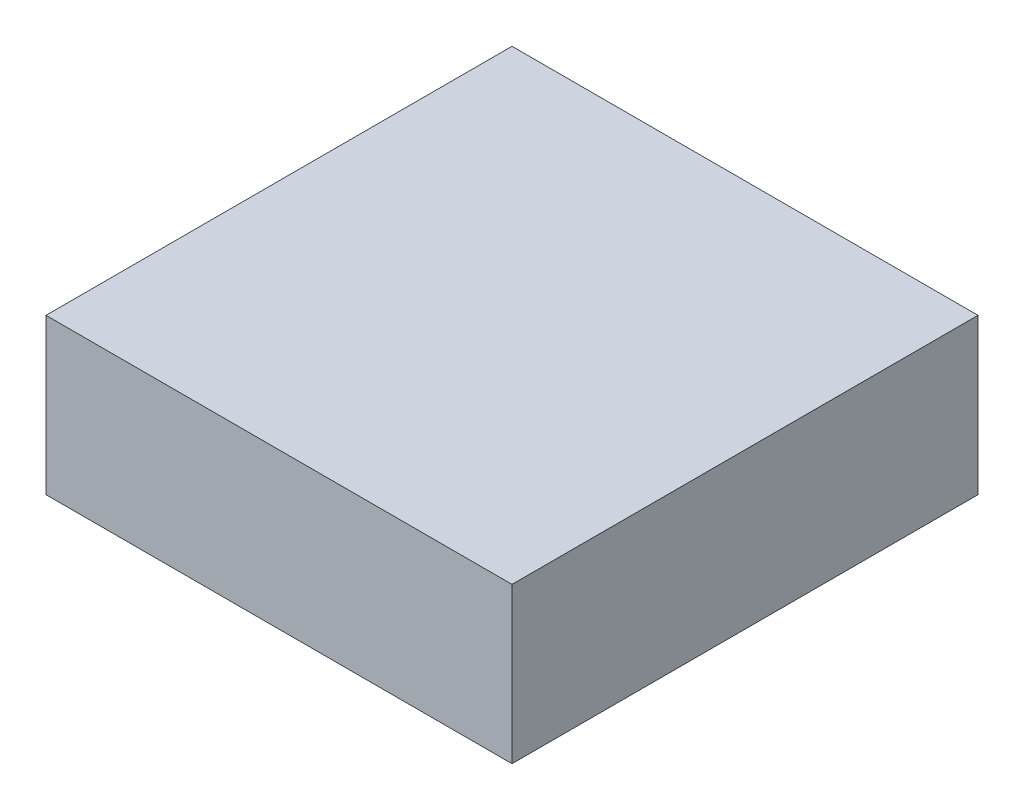
ISO-10303-21;
HEADER;
FILE_DESCRIPTION(('STEP AP214'),'2;1');
FILE_NAME('part.step','',(''),(''),'','','');
FILE_SCHEMA(('AUTOMOTIVE_DESIGN { 1 0 10303 214 1 1 1 1 }'));
ENDSEC;
DATA;
#1=APPLICATION_CONTEXT('core data for automotive mechanical design processes');
#2=APPLICATION_PROTOCOL_DEFINITION('international standard','automotive_design',2000,#1);
#3=PRODUCT_CONTEXT('',#1,'mechanical');
#4=PRODUCT('Part','Part','',(#3));
#5=PRODUCT_RELATED_PRODUCT_CATEGORY('part','',(#4));
#6=PRODUCT_DEFINITION_FORMATION('','',#4);
#7=PRODUCT_DEFINITION_CONTEXT('part definition',#1,'design');
#8=PRODUCT_DEFINITION('design','',#6,#7);
#9=PRODUCT_DEFINITION_SHAPE('','',#8);
#10=(LENGTH_UNIT() NAMED_UNIT(*) SI_UNIT(.MILLI.,.METRE.));
#11=(NAMED_UNIT(*) PLANE_ANGLE_UNIT() SI_UNIT($,.RADIAN.));
#12=(NAMED_UNIT(*) SI_UNIT($,.STERADIAN.) SOLID_ANGLE_UNIT());
#13=UNCERTAINTY_MEASURE_WITH_UNIT(LENGTH_MEASURE(1.E-05),#10,'distance_accuracy_value','');
#14=(GEOMETRIC_REPRESENTATION_CONTEXT(3) GLOBAL_UNCERTAINTY_ASSIGNED_CONTEXT((#13)) GLOBAL_UNIT_ASSIGNED_CONTEXT((#10,
#11,#12)) REPRESENTATION_CONTEXT('',''));
#15=CARTESIAN_POINT('',(0.,0.,0.));
#16=DIRECTION('',(0.,0.,1.));
#17=DIRECTION('',(1.,0.,0.));
#18=AXIS2_PLACEMENT_3D('',#15,#16,#17);
#19=CARTESIAN_POINT('',(6.30000000000001,4.2,6.29999999999999));
#20=DIRECTION('',(-1.,0.,0.));
#21=DIRECTION('',(0.,0.,1.));
#22=AXIS2_PLACEMENT_3D('',#19,#20,#21);
#23=PLANE('',#22);
#24=DIRECTION('',(0.,0.,-1.));
#25=VECTOR('',#24,1.);
#26=CARTESIAN_POINT('',(6.30000000000001,0.,6.29999999999999));
#27=LINE('',#26,#25);
#28=CARTESIAN_POINT('',(6.30000000000001,0.,6.29999999999999));
#29=VERTEX_POINT('',#28);
#30=CARTESIAN_POINT('',(6.30000000000001,0.,-6.30000000000001));
#31=VERTEX_POINT('',#30);
#32=EDGE_CURVE('E96',#29,#31,#27,.T.);
#33=ORIENTED_EDGE('',*,*,#32,.T.);
#34=DIRECTION('',(0.,-1.,0.));
#35=VECTOR('',#34,1.);
#36=CARTESIAN_POINT('',(6.30000000000001,4.2,-6.30000000000001));
#37=LINE('',#36,#35);
#38=CARTESIAN_POINT('',(6.30000000000001,4.2,-6.30000000000001));
#39=VERTEX_POINT('',#38);
#40=EDGE_CURVE('E11',#39,#31,#37,.T.);
#41=ORIENTED_EDGE('',*,*,#40,.F.);
#42=DIRECTION('',(0.,0.,-1.));
#43=VECTOR('',#42,1.);
#44=CARTESIAN_POINT('',(6.30000000000001,4.2,6.29999999999999));
#45=LINE('',#44,#43);
#46=CARTESIAN_POINT('',(6.30000000000001,4.2,6.29999999999999));
#47=VERTEX_POINT('',#46);
#48=EDGE_CURVE('E84',#47,#39,#45,.T.);
#49=ORIENTED_EDGE('',*,*,#48,.F.);
#50=DIRECTION('',(0.,-1.,0.));
#51=VECTOR('',#50,1.);
#52=CARTESIAN_POINT('',(6.30000000000001,4.2,6.29999999999999));
#53=LINE('',#52,#51);
#54=EDGE_CURVE('E92',#47,#29,#53,.T.);
#55=ORIENTED_EDGE('',*,*,#54,.T.);
#56=EDGE_LOOP('',(#33,#41,#49,#55));
#57=FACE_BOUND('',#56,.T.);
#58=ADVANCED_FACE('F33',(#57),#23,.F.);
#59=CARTESIAN_POINT('',(-6.29999999999999,4.2,-6.30000000000001));
#60=DIRECTION('',(0.,0.,1.));
#61=DIRECTION('',(1.,0.,0.));
#62=AXIS2_PLACEMENT_3D('',#59,#60,#61);
#63=PLANE('',#62);
#64=DIRECTION('',(-1.,0.,0.));
#65=VECTOR('',#64,1.);
#66=CARTESIAN_POINT('',(-6.29999999999999,0.,-6.30000000000001));
#67=LINE('',#66,#65);
#68=CARTESIAN_POINT('',(-6.29999999999999,0.,-6.30000000000001));
#69=VERTEX_POINT('',#68);
#70=EDGE_CURVE('E88',#31,#69,#67,.T.);
#71=ORIENTED_EDGE('',*,*,#70,.T.);
#72=DIRECTION('',(0.,-1.,0.));
#73=VECTOR('',#72,1.);
#74=CARTESIAN_POINT('',(-6.29999999999999,4.2,-6.30000000000001));
#75=LINE('',#74,#73);
#76=CARTESIAN_POINT('',(-6.29999999999999,4.2,-6.30000000000001));
#77=VERTEX_POINT('',#76);
#78=EDGE_CURVE('E41',#77,#69,#75,.T.);
#79=ORIENTED_EDGE('',*,*,#78,.F.);
#80=DIRECTION('',(-1.,0.,0.));
#81=VECTOR('',#80,1.);
#82=CARTESIAN_POINT('',(-6.29999999999999,4.2,-6.30000000000001));
#83=LINE('',#82,#81);
#84=EDGE_CURVE('E79',#39,#77,#83,.T.);
#85=ORIENTED_EDGE('',*,*,#84,.F.);
#86=ORIENTED_EDGE('',*,*,#40,.T.);
#87=EDGE_LOOP('',(#71,#79,#85,#86));
#88=FACE_BOUND('',#87,.T.);
#89=ADVANCED_FACE('F87',(#88),#63,.F.);
#90=CARTESIAN_POINT('',(-6.29999999999999,4.2,6.29999999999999));
#91=DIRECTION('',(1.,0.,0.));
#92=DIRECTION('',(0.,0.,-1.));
#93=AXIS2_PLACEMENT_3D('',#90,#91,#92);
#94=PLANE('',#93);
#95=DIRECTION('',(0.,0.,1.));
#96=VECTOR('',#95,1.);
#97=CARTESIAN_POINT('',(-6.29999999999999,0.,6.29999999999999));
#98=LINE('',#97,#96);
#99=CARTESIAN_POINT('',(-6.29999999999999,0.,6.29999999999999));
#100=VERTEX_POINT('',#99);
#101=EDGE_CURVE('E66',#69,#100,#98,.T.);
#102=ORIENTED_EDGE('',*,*,#101,.T.);
#103=DIRECTION('',(0.,-1.,0.));
#104=VECTOR('',#103,1.);
#105=CARTESIAN_POINT('',(-6.29999999999999,4.2,6.29999999999999));
#106=LINE('',#105,#104);
#107=CARTESIAN_POINT('',(-6.29999999999999,4.2,6.29999999999999));
#108=VERTEX_POINT('',#107);
#109=EDGE_CURVE('E89',#108,#100,#106,.T.);
#110=ORIENTED_EDGE('',*,*,#109,.F.);
#111=DIRECTION('',(0.,0.,1.));
#112=VECTOR('',#111,1.);
#113=CARTESIAN_POINT('',(-6.29999999999999,4.2,6.29999999999999));
#114=LINE('',#113,#112);
#115=EDGE_CURVE('E82',#77,#108,#114,.T.);
#116=ORIENTED_EDGE('',*,*,#115,.F.);
#117=ORIENTED_EDGE('',*,*,#78,.T.);
#118=EDGE_LOOP('',(#102,#110,#116,#117));
#119=FACE_BOUND('',#118,.T.);
#120=ADVANCED_FACE('F90',(#119),#94,.F.);
#121=CARTESIAN_POINT('',(-6.29999999999999,4.2,6.29999999999999));
#122=DIRECTION('',(0.,0.,-1.));
#123=DIRECTION('',(-1.,0.,0.));
#124=AXIS2_PLACEMENT_3D('',#121,#122,#123);
#125=PLANE('',#124);
#126=DIRECTION('',(1.,0.,0.));
#127=VECTOR('',#126,1.);
#128=CARTESIAN_POINT('',(-6.29999999999999,0.,6.29999999999999));
#129=LINE('',#128,#127);
#130=EDGE_CURVE('E72',#100,#29,#129,.T.);
#131=ORIENTED_EDGE('',*,*,#130,.T.);
#132=ORIENTED_EDGE('',*,*,#54,.F.);
#133=DIRECTION('',(1.,0.,0.));
#134=VECTOR('',#133,1.);
#135=CARTESIAN_POINT('',(-6.29999999999999,4.2,6.29999999999999));
#136=LINE('',#135,#134);
#137=EDGE_CURVE('E49',#108,#47,#136,.T.);
#138=ORIENTED_EDGE('',*,*,#137,.F.);
#139=ORIENTED_EDGE('',*,*,#109,.T.);
#140=EDGE_LOOP('',(#131,#132,#138,#139));
#141=FACE_BOUND('',#140,.T.);
#142=ADVANCED_FACE('F103',(#141),#125,.F.);
#143=CARTESIAN_POINT('',(0.,4.2,0.));
#144=DIRECTION('',(0.,-1.,0.));
#145=DIRECTION('',(0.,0.,-1.));
#146=AXIS2_PLACEMENT_3D('',#143,#144,#145);
#147=PLANE('',#146);
#148=ORIENTED_EDGE('',*,*,#48,.T.);
#149=ORIENTED_EDGE('',*,*,#84,.T.);
#150=ORIENTED_EDGE('',*,*,#115,.T.);
#151=ORIENTED_EDGE('',*,*,#137,.T.);
#152=EDGE_LOOP('',(#148,#149,#150,#151));
#153=FACE_BOUND('',#152,.T.);
#154=ADVANCED_FACE('F80',(#153),#147,.F.);
#155=CARTESIAN_POINT('',(0.,0.,0.));
#156=DIRECTION('',(0.,-1.,0.));
#157=DIRECTION('',(0.,0.,-1.));
#158=AXIS2_PLACEMENT_3D('',#155,#156,#157);
#159=PLANE('',#158);
#160=ORIENTED_EDGE('',*,*,#32,.F.);
#161=ORIENTED_EDGE('',*,*,#130,.F.);
#162=ORIENTED_EDGE('',*,*,#101,.F.);
#163=ORIENTED_EDGE('',*,*,#70,.F.);
#164=EDGE_LOOP('',(#160,#161,#162,#163));
#165=FACE_BOUND('',#164,.T.);
#166=ADVANCED_FACE('F106',(#165),#159,.T.);
#167=CLOSED_SHELL('',(#58,#89,#120,#142,#154,#166));
#168=MANIFOLD_SOLID_BREP('B2',#167);
#169=ADVANCED_BREP_SHAPE_REPRESENTATION('',(#18,#168),#14);
#170=SHAPE_DEFINITION_REPRESENTATION(#9,#169);
ENDSEC;
END-ISO-10303-21;
